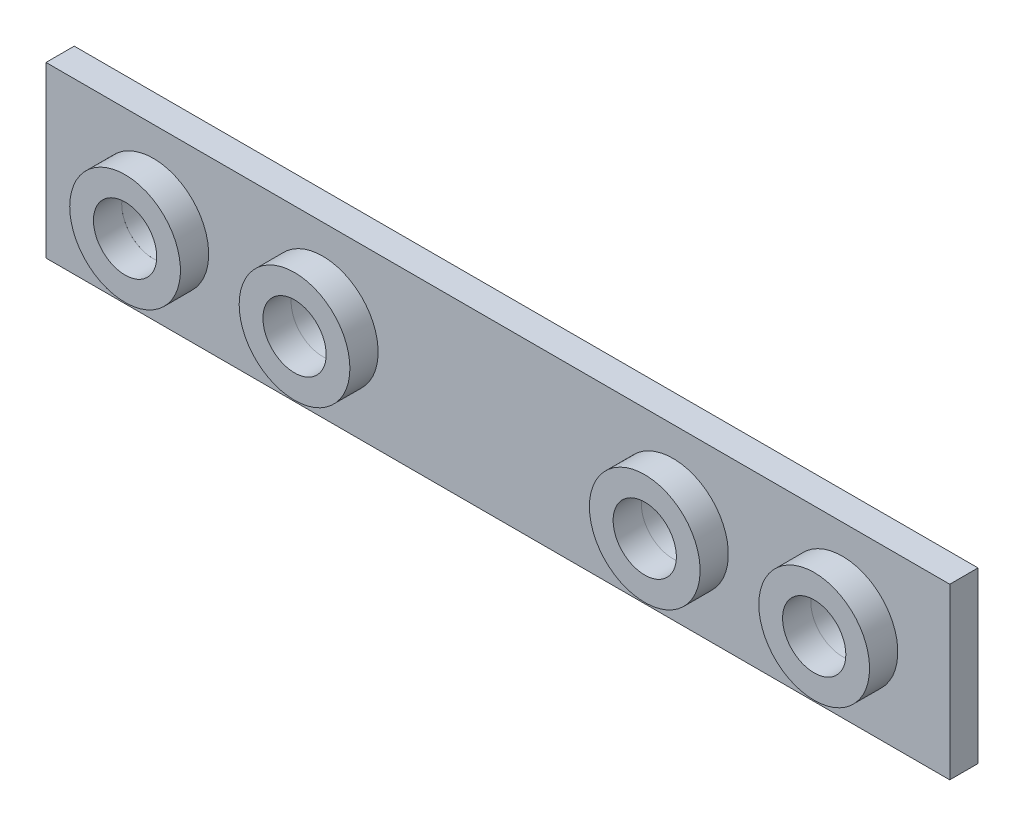
ISO-10303-21;
HEADER;
FILE_DESCRIPTION(('STEP AP214'),'2;1');
FILE_NAME('part.step','',(''),(''),'','','');
FILE_SCHEMA(('AUTOMOTIVE_DESIGN { 1 0 10303 214 1 1 1 1 }'));
ENDSEC;
DATA;
#1=APPLICATION_CONTEXT('core data for automotive mechanical design processes');
#2=APPLICATION_PROTOCOL_DEFINITION('international standard','automotive_design',2000,#1);
#3=PRODUCT_CONTEXT('',#1,'mechanical');
#4=PRODUCT('Part','Part','',(#3));
#5=PRODUCT_RELATED_PRODUCT_CATEGORY('part','',(#4));
#6=PRODUCT_DEFINITION_FORMATION('','',#4);
#7=PRODUCT_DEFINITION_CONTEXT('part definition',#1,'design');
#8=PRODUCT_DEFINITION('design','',#6,#7);
#9=PRODUCT_DEFINITION_SHAPE('','',#8);
#10=(LENGTH_UNIT() NAMED_UNIT(*) SI_UNIT(.MILLI.,.METRE.));
#11=(NAMED_UNIT(*) PLANE_ANGLE_UNIT() SI_UNIT($,.RADIAN.));
#12=(NAMED_UNIT(*) SI_UNIT($,.STERADIAN.) SOLID_ANGLE_UNIT());
#13=UNCERTAINTY_MEASURE_WITH_UNIT(LENGTH_MEASURE(1.E-05),#10,'distance_accuracy_value','');
#14=(GEOMETRIC_REPRESENTATION_CONTEXT(3) GLOBAL_UNCERTAINTY_ASSIGNED_CONTEXT((#13)) GLOBAL_UNIT_ASSIGNED_CONTEXT((#10,
#11,#12)) REPRESENTATION_CONTEXT('',''));
#15=CARTESIAN_POINT('',(0.,0.,0.));
#16=DIRECTION('',(0.,0.,1.));
#17=DIRECTION('',(1.,0.,0.));
#18=AXIS2_PLACEMENT_3D('',#15,#16,#17);
#19=CARTESIAN_POINT('',(40.,7.5,2.5));
#20=DIRECTION('',(0.,0.,1.));
#21=DIRECTION('',(1.,0.,0.));
#22=AXIS2_PLACEMENT_3D('',#19,#20,#21);
#23=PLANE('',#22);
#24=CARTESIAN_POINT('',(30.5,0.,2.5));
#25=DIRECTION('',(0.,0.,1.));
#26=DIRECTION('',(1.,0.,0.));
#27=AXIS2_PLACEMENT_3D('',#24,#25,#26);
#28=CIRCLE('',#27,2.8);
#29=CARTESIAN_POINT('',(33.3,0.,2.5));
#30=VERTEX_POINT('',#29);
#31=EDGE_CURVE('E62',#30,#30,#28,.T.);
#32=ORIENTED_EDGE('',*,*,#31,.T.);
#33=EDGE_LOOP('',(#32));
#34=FACE_BOUND('',#33,.T.);
#35=CARTESIAN_POINT('',(30.5,0.,2.5));
#36=DIRECTION('',(0.,0.,-1.));
#37=DIRECTION('',(-1.,0.,0.));
#38=AXIS2_PLACEMENT_3D('',#35,#36,#37);
#39=CIRCLE('',#38,4.9);
#40=CARTESIAN_POINT('',(25.6,0.,2.5));
#41=VERTEX_POINT('',#40);
#42=EDGE_CURVE('E52',#41,#41,#39,.F.);
#43=ORIENTED_EDGE('',*,*,#42,.F.);
#44=EDGE_LOOP('',(#43));
#45=FACE_BOUND('',#44,.T.);
#46=ADVANCED_FACE('F48',(#34,#45),#23,.F.);
#47=CARTESIAN_POINT('',(30.5,0.,5.));
#48=DIRECTION('',(0.,0.,1.));
#49=DIRECTION('',(1.,0.,0.));
#50=AXIS2_PLACEMENT_3D('',#47,#48,#49);
#51=PLANE('',#50);
#52=CARTESIAN_POINT('',(30.5,0.,5.));
#53=DIRECTION('',(0.,0.,1.));
#54=DIRECTION('',(1.,0.,0.));
#55=AXIS2_PLACEMENT_3D('',#52,#53,#54);
#56=CIRCLE('',#55,4.9);
#57=CARTESIAN_POINT('',(35.4,0.,5.));
#58=VERTEX_POINT('',#57);
#59=EDGE_CURVE('E56',#58,#58,#56,.T.);
#60=ORIENTED_EDGE('',*,*,#59,.T.);
#61=EDGE_LOOP('',(#60));
#62=FACE_BOUND('',#61,.T.);
#63=CARTESIAN_POINT('',(30.5,0.,5.));
#64=DIRECTION('',(0.,0.,1.));
#65=DIRECTION('',(1.,0.,0.));
#66=AXIS2_PLACEMENT_3D('',#63,#64,#65);
#67=CIRCLE('',#66,2.8);
#68=CARTESIAN_POINT('',(33.3,0.,5.));
#69=VERTEX_POINT('',#68);
#70=EDGE_CURVE('E11',#69,#69,#67,.T.);
#71=ORIENTED_EDGE('',*,*,#70,.F.);
#72=EDGE_LOOP('',(#71));
#73=FACE_BOUND('',#72,.T.);
#74=ADVANCED_FACE('F72',(#62,#73),#51,.T.);
#75=CARTESIAN_POINT('',(30.5,0.,5.));
#76=DIRECTION('',(0.,0.,-1.));
#77=DIRECTION('',(-1.,0.,0.));
#78=AXIS2_PLACEMENT_3D('',#75,#76,#77);
#79=CYLINDRICAL_SURFACE('',#78,2.8);
#80=ORIENTED_EDGE('',*,*,#31,.F.);
#81=EDGE_LOOP('',(#80));
#82=FACE_BOUND('',#81,.T.);
#83=ORIENTED_EDGE('',*,*,#70,.T.);
#84=EDGE_LOOP('',(#83));
#85=FACE_BOUND('',#84,.T.);
#86=ADVANCED_FACE('F50',(#82,#85),#79,.F.);
#87=CARTESIAN_POINT('',(30.5,0.,5.));
#88=DIRECTION('',(0.,0.,-1.));
#89=DIRECTION('',(-1.,0.,0.));
#90=AXIS2_PLACEMENT_3D('',#87,#88,#89);
#91=CYLINDRICAL_SURFACE('',#90,4.9);
#92=ORIENTED_EDGE('',*,*,#59,.F.);
#93=EDGE_LOOP('',(#92));
#94=FACE_BOUND('',#93,.T.);
#95=ORIENTED_EDGE('',*,*,#42,.T.);
#96=EDGE_LOOP('',(#95));
#97=FACE_BOUND('',#96,.T.);
#98=ADVANCED_FACE('F69',(#94,#97),#91,.T.);
#99=CLOSED_SHELL('',(#46,#74,#86,#98));
#100=MANIFOLD_SOLID_BREP('B2_NOT_SHOWN',#99);
#101=CARTESIAN_POINT('',(40.,7.5,2.5));
#102=DIRECTION('',(0.,0.,1.));
#103=DIRECTION('',(1.,0.,0.));
#104=AXIS2_PLACEMENT_3D('',#101,#102,#103);
#105=PLANE('',#104);
#106=CARTESIAN_POINT('',(15.5,0.,2.5));
#107=DIRECTION('',(0.,0.,1.));
#108=DIRECTION('',(1.,0.,0.));
#109=AXIS2_PLACEMENT_3D('',#106,#107,#108);
#110=CIRCLE('',#109,2.8);
#111=CARTESIAN_POINT('',(18.3,0.,2.5));
#112=VERTEX_POINT('',#111);
#113=EDGE_CURVE('E124',#112,#112,#110,.T.);
#114=ORIENTED_EDGE('',*,*,#113,.T.);
#115=EDGE_LOOP('',(#114));
#116=FACE_BOUND('',#115,.T.);
#117=CARTESIAN_POINT('',(15.5,0.,2.5));
#118=DIRECTION('',(0.,0.,-1.));
#119=DIRECTION('',(-1.,0.,0.));
#120=AXIS2_PLACEMENT_3D('',#117,#118,#119);
#121=CIRCLE('',#120,4.9);
#122=CARTESIAN_POINT('',(10.6,0.,2.5));
#123=VERTEX_POINT('',#122);
#124=EDGE_CURVE('E132',#123,#123,#121,.F.);
#125=ORIENTED_EDGE('',*,*,#124,.F.);
#126=EDGE_LOOP('',(#125));
#127=FACE_BOUND('',#126,.T.);
#128=ADVANCED_FACE('F121',(#116,#127),#105,.F.);
#129=CARTESIAN_POINT('',(15.5,0.,5.));
#130=DIRECTION('',(0.,0.,-1.));
#131=DIRECTION('',(-1.,0.,0.));
#132=AXIS2_PLACEMENT_3D('',#129,#130,#131);
#133=PLANE('',#132);
#134=CARTESIAN_POINT('',(15.5,0.,5.));
#135=DIRECTION('',(0.,0.,1.));
#136=DIRECTION('',(-1.,0.,0.));
#137=AXIS2_PLACEMENT_3D('',#134,#135,#136);
#138=CIRCLE('',#137,4.9);
#139=CARTESIAN_POINT('',(10.6,0.,5.));
#140=VERTEX_POINT('',#139);
#141=EDGE_CURVE('E128',#140,#140,#138,.T.);
#142=ORIENTED_EDGE('',*,*,#141,.T.);
#143=EDGE_LOOP('',(#142));
#144=FACE_BOUND('',#143,.T.);
#145=CARTESIAN_POINT('',(15.5,0.,5.));
#146=DIRECTION('',(0.,0.,1.));
#147=DIRECTION('',(-1.,0.,0.));
#148=AXIS2_PLACEMENT_3D('',#145,#146,#147);
#149=CIRCLE('',#148,2.8);
#150=CARTESIAN_POINT('',(12.7,0.,5.));
#151=VERTEX_POINT('',#150);
#152=EDGE_CURVE('E47',#151,#151,#149,.T.);
#153=ORIENTED_EDGE('',*,*,#152,.F.);
#154=EDGE_LOOP('',(#153));
#155=FACE_BOUND('',#154,.T.);
#156=ADVANCED_FACE('F146',(#144,#155),#133,.F.);
#157=CARTESIAN_POINT('',(15.5,0.,5.));
#158=DIRECTION('',(0.,0.,-1.));
#159=DIRECTION('',(-1.,0.,0.));
#160=AXIS2_PLACEMENT_3D('',#157,#158,#159);
#161=CYLINDRICAL_SURFACE('',#160,2.8);
#162=ORIENTED_EDGE('',*,*,#113,.F.);
#163=EDGE_LOOP('',(#162));
#164=FACE_BOUND('',#163,.T.);
#165=ORIENTED_EDGE('',*,*,#152,.T.);
#166=EDGE_LOOP('',(#165));
#167=FACE_BOUND('',#166,.T.);
#168=ADVANCED_FACE('F143',(#164,#167),#161,.F.);
#169=CARTESIAN_POINT('',(15.5,0.,5.));
#170=DIRECTION('',(0.,0.,-1.));
#171=DIRECTION('',(-1.,0.,0.));
#172=AXIS2_PLACEMENT_3D('',#169,#170,#171);
#173=CYLINDRICAL_SURFACE('',#172,4.9);
#174=ORIENTED_EDGE('',*,*,#141,.F.);
#175=EDGE_LOOP('',(#174));
#176=FACE_BOUND('',#175,.T.);
#177=ORIENTED_EDGE('',*,*,#124,.T.);
#178=EDGE_LOOP('',(#177));
#179=FACE_BOUND('',#178,.T.);
#180=ADVANCED_FACE('F145',(#176,#179),#173,.T.);
#181=CLOSED_SHELL('',(#128,#156,#168,#180));
#182=MANIFOLD_SOLID_BREP('B6_NOT_SHOWN',#181);
#183=CARTESIAN_POINT('',(40.,7.5,2.5));
#184=DIRECTION('',(0.,0.,1.));
#185=DIRECTION('',(1.,0.,0.));
#186=AXIS2_PLACEMENT_3D('',#183,#184,#185);
#187=PLANE('',#186);
#188=CARTESIAN_POINT('',(-15.5,0.,2.5));
#189=DIRECTION('',(0.,0.,1.));
#190=DIRECTION('',(1.,0.,0.));
#191=AXIS2_PLACEMENT_3D('',#188,#189,#190);
#192=CIRCLE('',#191,2.8);
#193=CARTESIAN_POINT('',(-12.7,0.,2.5));
#194=VERTEX_POINT('',#193);
#195=EDGE_CURVE('E197',#194,#194,#192,.T.);
#196=ORIENTED_EDGE('',*,*,#195,.T.);
#197=EDGE_LOOP('',(#196));
#198=FACE_BOUND('',#197,.T.);
#199=CARTESIAN_POINT('',(-15.5,0.,2.5));
#200=DIRECTION('',(0.,0.,-1.));
#201=DIRECTION('',(-1.,0.,0.));
#202=AXIS2_PLACEMENT_3D('',#199,#200,#201);
#203=CIRCLE('',#202,4.9);
#204=CARTESIAN_POINT('',(-20.4,0.,2.5));
#205=VERTEX_POINT('',#204);
#206=EDGE_CURVE('E205',#205,#205,#203,.F.);
#207=ORIENTED_EDGE('',*,*,#206,.F.);
#208=EDGE_LOOP('',(#207));
#209=FACE_BOUND('',#208,.T.);
#210=ADVANCED_FACE('F194',(#198,#209),#187,.F.);
#211=CARTESIAN_POINT('',(-15.5,0.,5.));
#212=DIRECTION('',(0.,0.,1.));
#213=DIRECTION('',(1.,0.,0.));
#214=AXIS2_PLACEMENT_3D('',#211,#212,#213);
#215=PLANE('',#214);
#216=CARTESIAN_POINT('',(-15.5,0.,5.));
#217=DIRECTION('',(0.,0.,1.));
#218=DIRECTION('',(1.,0.,0.));
#219=AXIS2_PLACEMENT_3D('',#216,#217,#218);
#220=CIRCLE('',#219,4.9);
#221=CARTESIAN_POINT('',(-10.6,0.,5.));
#222=VERTEX_POINT('',#221);
#223=EDGE_CURVE('E201',#222,#222,#220,.T.);
#224=ORIENTED_EDGE('',*,*,#223,.T.);
#225=EDGE_LOOP('',(#224));
#226=FACE_BOUND('',#225,.T.);
#227=CARTESIAN_POINT('',(-15.5,0.,5.));
#228=DIRECTION('',(0.,0.,1.));
#229=DIRECTION('',(1.,0.,0.));
#230=AXIS2_PLACEMENT_3D('',#227,#228,#229);
#231=CIRCLE('',#230,2.8);
#232=CARTESIAN_POINT('',(-12.7,0.,5.));
#233=VERTEX_POINT('',#232);
#234=EDGE_CURVE('E120',#233,#233,#231,.T.);
#235=ORIENTED_EDGE('',*,*,#234,.F.);
#236=EDGE_LOOP('',(#235));
#237=FACE_BOUND('',#236,.T.);
#238=ADVANCED_FACE('F219',(#226,#237),#215,.T.);
#239=CARTESIAN_POINT('',(-15.5,0.,5.));
#240=DIRECTION('',(0.,0.,-1.));
#241=DIRECTION('',(-1.,0.,0.));
#242=AXIS2_PLACEMENT_3D('',#239,#240,#241);
#243=CYLINDRICAL_SURFACE('',#242,2.8);
#244=ORIENTED_EDGE('',*,*,#195,.F.);
#245=EDGE_LOOP('',(#244));
#246=FACE_BOUND('',#245,.T.);
#247=ORIENTED_EDGE('',*,*,#234,.T.);
#248=EDGE_LOOP('',(#247));
#249=FACE_BOUND('',#248,.T.);
#250=ADVANCED_FACE('F216',(#246,#249),#243,.F.);
#251=CARTESIAN_POINT('',(-15.5,0.,5.));
#252=DIRECTION('',(0.,0.,-1.));
#253=DIRECTION('',(-1.,0.,0.));
#254=AXIS2_PLACEMENT_3D('',#251,#252,#253);
#255=CYLINDRICAL_SURFACE('',#254,4.9);
#256=ORIENTED_EDGE('',*,*,#223,.F.);
#257=EDGE_LOOP('',(#256));
#258=FACE_BOUND('',#257,.T.);
#259=ORIENTED_EDGE('',*,*,#206,.T.);
#260=EDGE_LOOP('',(#259));
#261=FACE_BOUND('',#260,.T.);
#262=ADVANCED_FACE('F218',(#258,#261),#255,.T.);
#263=CLOSED_SHELL('',(#210,#238,#250,#262));
#264=MANIFOLD_SOLID_BREP('B42_NOT_SHOWN',#263);
#265=CARTESIAN_POINT('',(40.,7.5,2.5));
#266=DIRECTION('',(0.,0.,1.));
#267=DIRECTION('',(1.,0.,0.));
#268=AXIS2_PLACEMENT_3D('',#265,#266,#267);
#269=PLANE('',#268);
#270=CARTESIAN_POINT('',(-30.5,0.,2.5));
#271=DIRECTION('',(0.,0.,1.));
#272=DIRECTION('',(1.,0.,0.));
#273=AXIS2_PLACEMENT_3D('',#270,#271,#272);
#274=CIRCLE('',#273,2.8);
#275=CARTESIAN_POINT('',(-27.7,0.,2.5));
#276=VERTEX_POINT('',#275);
#277=EDGE_CURVE('E271',#276,#276,#274,.T.);
#278=ORIENTED_EDGE('',*,*,#277,.T.);
#279=EDGE_LOOP('',(#278));
#280=FACE_BOUND('',#279,.T.);
#281=CARTESIAN_POINT('',(-30.5,0.,2.5));
#282=DIRECTION('',(0.,0.,-1.));
#283=DIRECTION('',(-1.,0.,0.));
#284=AXIS2_PLACEMENT_3D('',#281,#282,#283);
#285=CIRCLE('',#284,4.9);
#286=CARTESIAN_POINT('',(-35.4,0.,2.5));
#287=VERTEX_POINT('',#286);
#288=EDGE_CURVE('E193',#287,#287,#285,.T.);
#289=ORIENTED_EDGE('',*,*,#288,.T.);
#290=EDGE_LOOP('',(#289));
#291=FACE_BOUND('',#290,.T.);
#292=ADVANCED_FACE('F268',(#280,#291),#269,.F.);
#293=CARTESIAN_POINT('',(-30.5,0.,5.));
#294=DIRECTION('',(0.,0.,-1.));
#295=DIRECTION('',(-1.,0.,0.));
#296=AXIS2_PLACEMENT_3D('',#293,#294,#295);
#297=CYLINDRICAL_SURFACE('',#296,4.9);
#298=CARTESIAN_POINT('',(-30.5,0.,5.));
#299=DIRECTION('',(0.,0.,1.));
#300=DIRECTION('',(-1.,0.,0.));
#301=AXIS2_PLACEMENT_3D('',#298,#299,#300);
#302=CIRCLE('',#301,4.9);
#303=CARTESIAN_POINT('',(-35.4,0.,5.));
#304=VERTEX_POINT('',#303);
#305=EDGE_CURVE('E279',#304,#304,#302,.T.);
#306=ORIENTED_EDGE('',*,*,#305,.F.);
#307=EDGE_LOOP('',(#306));
#308=FACE_BOUND('',#307,.T.);
#309=ORIENTED_EDGE('',*,*,#288,.F.);
#310=EDGE_LOOP('',(#309));
#311=FACE_BOUND('',#310,.T.);
#312=ADVANCED_FACE('F289',(#308,#311),#297,.T.);
#313=CARTESIAN_POINT('',(-30.5,0.,5.));
#314=DIRECTION('',(0.,0.,-1.));
#315=DIRECTION('',(-1.,0.,0.));
#316=AXIS2_PLACEMENT_3D('',#313,#314,#315);
#317=CYLINDRICAL_SURFACE('',#316,2.8);
#318=ORIENTED_EDGE('',*,*,#277,.F.);
#319=EDGE_LOOP('',(#318));
#320=FACE_BOUND('',#319,.T.);
#321=CARTESIAN_POINT('',(-30.5,0.,5.));
#322=DIRECTION('',(0.,0.,1.));
#323=DIRECTION('',(-1.,0.,0.));
#324=AXIS2_PLACEMENT_3D('',#321,#322,#323);
#325=CIRCLE('',#324,2.8);
#326=CARTESIAN_POINT('',(-33.3,0.,5.));
#327=VERTEX_POINT('',#326);
#328=EDGE_CURVE('E281',#327,#327,#325,.T.);
#329=ORIENTED_EDGE('',*,*,#328,.T.);
#330=EDGE_LOOP('',(#329));
#331=FACE_BOUND('',#330,.T.);
#332=ADVANCED_FACE('F292',(#320,#331),#317,.F.);
#333=CARTESIAN_POINT('',(-30.5,0.,5.));
#334=DIRECTION('',(0.,0.,-1.));
#335=DIRECTION('',(-1.,0.,0.));
#336=AXIS2_PLACEMENT_3D('',#333,#334,#335);
#337=PLANE('',#336);
#338=ORIENTED_EDGE('',*,*,#305,.T.);
#339=EDGE_LOOP('',(#338));
#340=FACE_BOUND('',#339,.T.);
#341=ORIENTED_EDGE('',*,*,#328,.F.);
#342=EDGE_LOOP('',(#341));
#343=FACE_BOUND('',#342,.T.);
#344=ADVANCED_FACE('F286',(#340,#343),#337,.F.);
#345=CLOSED_SHELL('',(#292,#312,#332,#344));
#346=MANIFOLD_SOLID_BREP('B115_NOT_SHOWN',#345);
#347=CARTESIAN_POINT('',(40.,7.5,2.5));
#348=DIRECTION('',(0.,0.,1.));
#349=DIRECTION('',(1.,0.,0.));
#350=AXIS2_PLACEMENT_3D('',#347,#348,#349);
#351=PLANE('',#350);
#352=CARTESIAN_POINT('',(-30.5,0.,2.5));
#353=DIRECTION('',(0.,0.,1.));
#354=DIRECTION('',(1.,0.,0.));
#355=AXIS2_PLACEMENT_3D('',#352,#353,#354);
#356=CIRCLE('',#355,2.8);
#357=CARTESIAN_POINT('',(-27.7,0.,2.5));
#358=VERTEX_POINT('',#357);
#359=EDGE_CURVE('E430',#358,#358,#356,.T.);
#360=ORIENTED_EDGE('',*,*,#359,.F.);
#361=EDGE_LOOP('',(#360));
#362=FACE_BOUND('',#361,.T.);
#363=DIRECTION('',(0.,1.,0.));
#364=VECTOR('',#363,1.);
#365=CARTESIAN_POINT('',(40.,-7.5,2.5));
#366=LINE('',#365,#364);
#367=CARTESIAN_POINT('',(40.,-7.5,2.5));
#368=VERTEX_POINT('',#367);
#369=CARTESIAN_POINT('',(40.,7.5,2.5));
#370=VERTEX_POINT('',#369);
#371=EDGE_CURVE('E402',#368,#370,#366,.T.);
#372=ORIENTED_EDGE('',*,*,#371,.T.);
#373=DIRECTION('',(-1.,0.,0.));
#374=VECTOR('',#373,1.);
#375=CARTESIAN_POINT('',(-40.,7.5,2.5));
#376=LINE('',#375,#374);
#377=CARTESIAN_POINT('',(-40.,7.5,2.5));
#378=VERTEX_POINT('',#377);
#379=EDGE_CURVE('E369',#370,#378,#376,.T.);
#380=ORIENTED_EDGE('',*,*,#379,.T.);
#381=DIRECTION('',(0.,-1.,0.));
#382=VECTOR('',#381,1.);
#383=CARTESIAN_POINT('',(-40.,-7.5,2.5));
#384=LINE('',#383,#382);
#385=CARTESIAN_POINT('',(-40.,-7.5,2.5));
#386=VERTEX_POINT('',#385);
#387=EDGE_CURVE('E415',#378,#386,#384,.T.);
#388=ORIENTED_EDGE('',*,*,#387,.T.);
#389=DIRECTION('',(1.,0.,0.));
#390=VECTOR('',#389,1.);
#391=CARTESIAN_POINT('',(-40.,-7.5,2.5));
#392=LINE('',#391,#390);
#393=EDGE_CURVE('E394',#386,#368,#392,.T.);
#394=ORIENTED_EDGE('',*,*,#393,.T.);
#395=EDGE_LOOP('',(#372,#380,#388,#394));
#396=FACE_BOUND('',#395,.T.);
#397=CARTESIAN_POINT('',(-15.5,0.,2.5));
#398=DIRECTION('',(0.,0.,1.));
#399=DIRECTION('',(1.,0.,0.));
#400=AXIS2_PLACEMENT_3D('',#397,#398,#399);
#401=CIRCLE('',#400,2.8);
#402=CARTESIAN_POINT('',(-12.7,0.,2.5));
#403=VERTEX_POINT('',#402);
#404=EDGE_CURVE('E433',#403,#403,#401,.T.);
#405=ORIENTED_EDGE('',*,*,#404,.F.);
#406=EDGE_LOOP('',(#405));
#407=FACE_BOUND('',#406,.T.);
#408=CARTESIAN_POINT('',(15.5,0.,2.5));
#409=DIRECTION('',(0.,0.,1.));
#410=DIRECTION('',(1.,0.,0.));
#411=AXIS2_PLACEMENT_3D('',#408,#409,#410);
#412=CIRCLE('',#411,2.8);
#413=CARTESIAN_POINT('',(18.3,0.,2.5));
#414=VERTEX_POINT('',#413);
#415=EDGE_CURVE('E337',#414,#414,#412,.T.);
#416=ORIENTED_EDGE('',*,*,#415,.F.);
#417=EDGE_LOOP('',(#416));
#418=FACE_BOUND('',#417,.T.);
#419=CARTESIAN_POINT('',(30.5,0.,2.5));
#420=DIRECTION('',(0.,0.,1.));
#421=DIRECTION('',(1.,0.,0.));
#422=AXIS2_PLACEMENT_3D('',#419,#420,#421);
#423=CIRCLE('',#422,2.8);
#424=CARTESIAN_POINT('',(33.3,0.,2.5));
#425=VERTEX_POINT('',#424);
#426=EDGE_CURVE('E440',#425,#425,#423,.T.);
#427=ORIENTED_EDGE('',*,*,#426,.F.);
#428=EDGE_LOOP('',(#427));
#429=FACE_BOUND('',#428,.T.);
#430=ADVANCED_FACE('F333',(#362,#396,#407,#418,#429),#351,.T.);
#431=CARTESIAN_POINT('',(-40.,7.5,2.5));
#432=DIRECTION('',(0.,-1.,0.));
#433=DIRECTION('',(0.,0.,-1.));
#434=AXIS2_PLACEMENT_3D('',#431,#432,#433);
#435=PLANE('',#434);
#436=DIRECTION('',(-1.,0.,0.));
#437=VECTOR('',#436,1.);
#438=CARTESIAN_POINT('',(-40.,7.5,0.));
#439=LINE('',#438,#437);
#440=CARTESIAN_POINT('',(40.,7.5,0.));
#441=VERTEX_POINT('',#440);
#442=CARTESIAN_POINT('',(-40.,7.5,0.));
#443=VERTEX_POINT('',#442);
#444=EDGE_CURVE('E353',#441,#443,#439,.T.);
#445=ORIENTED_EDGE('',*,*,#444,.T.);
#446=DIRECTION('',(0.,0.,-1.));
#447=VECTOR('',#446,1.);
#448=CARTESIAN_POINT('',(-40.,7.5,2.5));
#449=LINE('',#448,#447);
#450=EDGE_CURVE('E390',#378,#443,#449,.T.);
#451=ORIENTED_EDGE('',*,*,#450,.F.);
#452=ORIENTED_EDGE('',*,*,#379,.F.);
#453=DIRECTION('',(0.,0.,-1.));
#454=VECTOR('',#453,1.);
#455=CARTESIAN_POINT('',(40.,7.5,2.5));
#456=LINE('',#455,#454);
#457=EDGE_CURVE('E445',#370,#441,#456,.T.);
#458=ORIENTED_EDGE('',*,*,#457,.T.);
#459=EDGE_LOOP('',(#445,#451,#452,#458));
#460=FACE_BOUND('',#459,.T.);
#461=ADVANCED_FACE('F460',(#460),#435,.F.);
#462=CARTESIAN_POINT('',(-40.,-7.5,2.5));
#463=DIRECTION('',(1.,0.,0.));
#464=DIRECTION('',(0.,0.,-1.));
#465=AXIS2_PLACEMENT_3D('',#462,#463,#464);
#466=PLANE('',#465);
#467=DIRECTION('',(0.,-1.,0.));
#468=VECTOR('',#467,1.);
#469=CARTESIAN_POINT('',(-40.,-7.5,0.));
#470=LINE('',#469,#468);
#471=CARTESIAN_POINT('',(-40.,-7.5,0.));
#472=VERTEX_POINT('',#471);
#473=EDGE_CURVE('E385',#443,#472,#470,.T.);
#474=ORIENTED_EDGE('',*,*,#473,.T.);
#475=DIRECTION('',(0.,0.,-1.));
#476=VECTOR('',#475,1.);
#477=CARTESIAN_POINT('',(-40.,-7.5,2.5));
#478=LINE('',#477,#476);
#479=EDGE_CURVE('E388',#386,#472,#478,.T.);
#480=ORIENTED_EDGE('',*,*,#479,.F.);
#481=ORIENTED_EDGE('',*,*,#387,.F.);
#482=ORIENTED_EDGE('',*,*,#450,.T.);
#483=EDGE_LOOP('',(#474,#480,#481,#482));
#484=FACE_BOUND('',#483,.T.);
#485=ADVANCED_FACE('F386',(#484),#466,.F.);
#486=CARTESIAN_POINT('',(40.,-7.5,2.5));
#487=DIRECTION('',(-1.,0.,0.));
#488=DIRECTION('',(0.,0.,1.));
#489=AXIS2_PLACEMENT_3D('',#486,#487,#488);
#490=PLANE('',#489);
#491=DIRECTION('',(0.,1.,0.));
#492=VECTOR('',#491,1.);
#493=CARTESIAN_POINT('',(40.,-7.5,0.));
#494=LINE('',#493,#492);
#495=CARTESIAN_POINT('',(40.,-7.5,0.));
#496=VERTEX_POINT('',#495);
#497=EDGE_CURVE('E400',#496,#441,#494,.T.);
#498=ORIENTED_EDGE('',*,*,#497,.T.);
#499=ORIENTED_EDGE('',*,*,#457,.F.);
#500=ORIENTED_EDGE('',*,*,#371,.F.);
#501=DIRECTION('',(0.,0.,-1.));
#502=VECTOR('',#501,1.);
#503=CARTESIAN_POINT('',(40.,-7.5,2.5));
#504=LINE('',#503,#502);
#505=EDGE_CURVE('E396',#368,#496,#504,.T.);
#506=ORIENTED_EDGE('',*,*,#505,.T.);
#507=EDGE_LOOP('',(#498,#499,#500,#506));
#508=FACE_BOUND('',#507,.T.);
#509=ADVANCED_FACE('F456',(#508),#490,.F.);
#510=CARTESIAN_POINT('',(-30.5,0.,0.));
#511=DIRECTION('',(0.,0.,-1.));
#512=DIRECTION('',(-1.,0.,0.));
#513=AXIS2_PLACEMENT_3D('',#510,#511,#512);
#514=PLANE('',#513);
#515=CARTESIAN_POINT('',(-30.5,0.,0.));
#516=DIRECTION('',(0.,0.,1.));
#517=DIRECTION('',(1.,0.,0.));
#518=AXIS2_PLACEMENT_3D('',#515,#516,#517);
#519=CIRCLE('',#518,2.8);
#520=CARTESIAN_POINT('',(-27.7,0.,0.));
#521=VERTEX_POINT('',#520);
#522=EDGE_CURVE('E412',#521,#521,#519,.T.);
#523=ORIENTED_EDGE('',*,*,#522,.T.);
#524=EDGE_LOOP('',(#523));
#525=FACE_BOUND('',#524,.T.);
#526=CARTESIAN_POINT('',(-15.5,0.,0.));
#527=DIRECTION('',(0.,0.,1.));
#528=DIRECTION('',(1.,0.,0.));
#529=AXIS2_PLACEMENT_3D('',#526,#527,#528);
#530=CIRCLE('',#529,2.8);
#531=CARTESIAN_POINT('',(-12.7,0.,0.));
#532=VERTEX_POINT('',#531);
#533=EDGE_CURVE('E423',#532,#532,#530,.T.);
#534=ORIENTED_EDGE('',*,*,#533,.T.);
#535=EDGE_LOOP('',(#534));
#536=FACE_BOUND('',#535,.T.);
#537=CARTESIAN_POINT('',(15.5,0.,0.));
#538=DIRECTION('',(0.,0.,1.));
#539=DIRECTION('',(1.,0.,0.));
#540=AXIS2_PLACEMENT_3D('',#537,#538,#539);
#541=CIRCLE('',#540,2.8);
#542=CARTESIAN_POINT('',(18.3,0.,0.));
#543=VERTEX_POINT('',#542);
#544=EDGE_CURVE('E344',#543,#543,#541,.T.);
#545=ORIENTED_EDGE('',*,*,#544,.T.);
#546=EDGE_LOOP('',(#545));
#547=FACE_BOUND('',#546,.T.);
#548=CARTESIAN_POINT('',(30.5,0.,0.));
#549=DIRECTION('',(0.,0.,1.));
#550=DIRECTION('',(1.,0.,0.));
#551=AXIS2_PLACEMENT_3D('',#548,#549,#550);
#552=CIRCLE('',#551,2.8);
#553=CARTESIAN_POINT('',(33.3,0.,0.));
#554=VERTEX_POINT('',#553);
#555=EDGE_CURVE('E266',#554,#554,#552,.T.);
#556=ORIENTED_EDGE('',*,*,#555,.T.);
#557=EDGE_LOOP('',(#556));
#558=FACE_BOUND('',#557,.T.);
#559=ORIENTED_EDGE('',*,*,#497,.F.);
#560=DIRECTION('',(1.,0.,0.));
#561=VECTOR('',#560,1.);
#562=CARTESIAN_POINT('',(-40.,-7.5,0.));
#563=LINE('',#562,#561);
#564=EDGE_CURVE('E379',#472,#496,#563,.T.);
#565=ORIENTED_EDGE('',*,*,#564,.F.);
#566=ORIENTED_EDGE('',*,*,#473,.F.);
#567=ORIENTED_EDGE('',*,*,#444,.F.);
#568=EDGE_LOOP('',(#559,#565,#566,#567));
#569=FACE_BOUND('',#568,.T.);
#570=ADVANCED_FACE('F398',(#525,#536,#547,#558,#569),#514,.T.);
#571=CARTESIAN_POINT('',(30.5,0.,5.));
#572=DIRECTION('',(0.,0.,-1.));
#573=DIRECTION('',(-1.,0.,0.));
#574=AXIS2_PLACEMENT_3D('',#571,#572,#573);
#575=CYLINDRICAL_SURFACE('',#574,2.8);
#576=ORIENTED_EDGE('',*,*,#555,.F.);
#577=EDGE_LOOP('',(#576));
#578=FACE_BOUND('',#577,.T.);
#579=ORIENTED_EDGE('',*,*,#426,.T.);
#580=EDGE_LOOP('',(#579));
#581=FACE_BOUND('',#580,.T.);
#582=ADVANCED_FACE('F335',(#578,#581),#575,.F.);
#583=CARTESIAN_POINT('',(15.5,0.,5.));
#584=DIRECTION('',(0.,0.,-1.));
#585=DIRECTION('',(-1.,0.,0.));
#586=AXIS2_PLACEMENT_3D('',#583,#584,#585);
#587=CYLINDRICAL_SURFACE('',#586,2.8);
#588=ORIENTED_EDGE('',*,*,#544,.F.);
#589=EDGE_LOOP('',(#588));
#590=FACE_BOUND('',#589,.T.);
#591=ORIENTED_EDGE('',*,*,#415,.T.);
#592=EDGE_LOOP('',(#591));
#593=FACE_BOUND('',#592,.T.);
#594=ADVANCED_FACE('F484',(#590,#593),#587,.F.);
#595=CARTESIAN_POINT('',(-15.5,0.,5.));
#596=DIRECTION('',(0.,0.,-1.));
#597=DIRECTION('',(-1.,0.,0.));
#598=AXIS2_PLACEMENT_3D('',#595,#596,#597);
#599=CYLINDRICAL_SURFACE('',#598,2.8);
#600=ORIENTED_EDGE('',*,*,#533,.F.);
#601=EDGE_LOOP('',(#600));
#602=FACE_BOUND('',#601,.T.);
#603=ORIENTED_EDGE('',*,*,#404,.T.);
#604=EDGE_LOOP('',(#603));
#605=FACE_BOUND('',#604,.T.);
#606=ADVANCED_FACE('F478',(#602,#605),#599,.F.);
#607=CARTESIAN_POINT('',(-40.,-7.5,2.5));
#608=DIRECTION('',(0.,1.,0.));
#609=DIRECTION('',(0.,0.,1.));
#610=AXIS2_PLACEMENT_3D('',#607,#608,#609);
#611=PLANE('',#610);
#612=ORIENTED_EDGE('',*,*,#564,.T.);
#613=ORIENTED_EDGE('',*,*,#505,.F.);
#614=ORIENTED_EDGE('',*,*,#393,.F.);
#615=ORIENTED_EDGE('',*,*,#479,.T.);
#616=EDGE_LOOP('',(#612,#613,#614,#615));
#617=FACE_BOUND('',#616,.T.);
#618=ADVANCED_FACE('F393',(#617),#611,.F.);
#619=CARTESIAN_POINT('',(-30.5,0.,5.));
#620=DIRECTION('',(0.,0.,-1.));
#621=DIRECTION('',(-1.,0.,0.));
#622=AXIS2_PLACEMENT_3D('',#619,#620,#621);
#623=CYLINDRICAL_SURFACE('',#622,2.8);
#624=ORIENTED_EDGE('',*,*,#522,.F.);
#625=EDGE_LOOP('',(#624));
#626=FACE_BOUND('',#625,.T.);
#627=ORIENTED_EDGE('',*,*,#359,.T.);
#628=EDGE_LOOP('',(#627));
#629=FACE_BOUND('',#628,.T.);
#630=ADVANCED_FACE('F463',(#626,#629),#623,.F.);
#631=CLOSED_SHELL('',(#430,#461,#485,#509,#570,#582,#594,#606,#618,#630));
#632=MANIFOLD_SOLID_BREP('B188',#631);
#633=ADVANCED_BREP_SHAPE_REPRESENTATION('',(#18,#100,#182,#264,#346,#632),#14);
#634=SHAPE_DEFINITION_REPRESENTATION(#9,#633);
ENDSEC;
END-ISO-10303-21;
